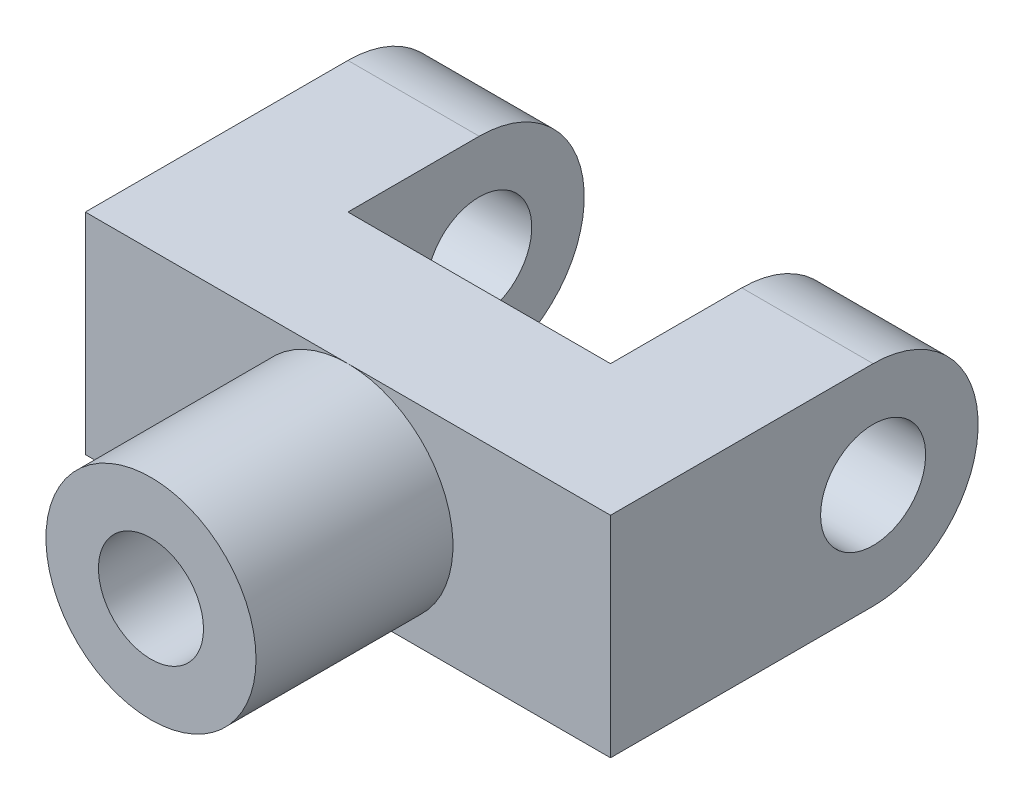
ISO-10303-21;
HEADER;
FILE_DESCRIPTION(('STEP AP214'),'2;1');
FILE_NAME('part.step','',(''),(''),'','','');
FILE_SCHEMA(('AUTOMOTIVE_DESIGN { 1 0 10303 214 1 1 1 1 }'));
ENDSEC;
DATA;
#1=APPLICATION_CONTEXT('core data for automotive mechanical design processes');
#2=APPLICATION_PROTOCOL_DEFINITION('international standard','automotive_design',2000,#1);
#3=PRODUCT_CONTEXT('',#1,'mechanical');
#4=PRODUCT('Part','Part','',(#3));
#5=PRODUCT_RELATED_PRODUCT_CATEGORY('part','',(#4));
#6=PRODUCT_DEFINITION_FORMATION('','',#4);
#7=PRODUCT_DEFINITION_CONTEXT('part definition',#1,'design');
#8=PRODUCT_DEFINITION('design','',#6,#7);
#9=PRODUCT_DEFINITION_SHAPE('','',#8);
#10=(LENGTH_UNIT() NAMED_UNIT(*) SI_UNIT(.MILLI.,.METRE.));
#11=(NAMED_UNIT(*) PLANE_ANGLE_UNIT() SI_UNIT($,.RADIAN.));
#12=(NAMED_UNIT(*) SI_UNIT($,.STERADIAN.) SOLID_ANGLE_UNIT());
#13=UNCERTAINTY_MEASURE_WITH_UNIT(LENGTH_MEASURE(1.E-05),#10,'distance_accuracy_value','');
#14=(GEOMETRIC_REPRESENTATION_CONTEXT(3) GLOBAL_UNCERTAINTY_ASSIGNED_CONTEXT((#13)) GLOBAL_UNIT_ASSIGNED_CONTEXT((#10,
#11,#12)) REPRESENTATION_CONTEXT('',''));
#15=CARTESIAN_POINT('',(0.,0.,0.));
#16=DIRECTION('',(0.,0.,1.));
#17=DIRECTION('',(1.,0.,0.));
#18=AXIS2_PLACEMENT_3D('',#15,#16,#17);
#19=CARTESIAN_POINT('',(0.,0.,-2.5));
#20=DIRECTION('',(0.,0.,1.));
#21=DIRECTION('',(1.,0.,0.));
#22=AXIS2_PLACEMENT_3D('',#19,#20,#21);
#23=PLANE('',#22);
#24=DIRECTION('',(0.,-1.,0.));
#25=VECTOR('',#24,1.);
#26=CARTESIAN_POINT('',(5.,0.,-2.5));
#27=LINE('',#26,#25);
#28=CARTESIAN_POINT('',(5.,4.,-2.5));
#29=VERTEX_POINT('',#28);
#30=CARTESIAN_POINT('',(5.,-4.,-2.5));
#31=VERTEX_POINT('',#30);
#32=EDGE_CURVE('E54',#29,#31,#27,.T.);
#33=ORIENTED_EDGE('',*,*,#32,.T.);
#34=DIRECTION('',(1.,0.,0.));
#35=VECTOR('',#34,1.);
#36=CARTESIAN_POINT('',(0.,-4.,-2.5));
#37=LINE('',#36,#35);
#38=CARTESIAN_POINT('',(-5.,-4.,-2.5));
#39=VERTEX_POINT('',#38);
#40=EDGE_CURVE('E184',#39,#31,#37,.T.);
#41=ORIENTED_EDGE('',*,*,#40,.F.);
#42=DIRECTION('',(0.,-1.,0.));
#43=VECTOR('',#42,1.);
#44=CARTESIAN_POINT('',(-5.,0.,-2.5));
#45=LINE('',#44,#43);
#46=CARTESIAN_POINT('',(-5.,4.,-2.5));
#47=VERTEX_POINT('',#46);
#48=EDGE_CURVE('E146',#47,#39,#45,.T.);
#49=ORIENTED_EDGE('',*,*,#48,.F.);
#50=DIRECTION('',(1.,0.,0.));
#51=VECTOR('',#50,1.);
#52=CARTESIAN_POINT('',(0.,4.,-2.5));
#53=LINE('',#52,#51);
#54=EDGE_CURVE('E49',#47,#29,#53,.T.);
#55=ORIENTED_EDGE('',*,*,#54,.T.);
#56=EDGE_LOOP('',(#33,#41,#49,#55));
#57=FACE_BOUND('',#56,.T.);
#58=ADVANCED_FACE('F34',(#57),#23,.F.);
#59=CARTESIAN_POINT('',(0.,0.,2.5));
#60=DIRECTION('',(0.,0.,1.));
#61=DIRECTION('',(1.,0.,0.));
#62=AXIS2_PLACEMENT_3D('',#59,#60,#61);
#63=PLANE('',#62);
#64=DIRECTION('',(1.,0.,0.));
#65=VECTOR('',#64,1.);
#66=CARTESIAN_POINT('',(0.,-4.,2.5));
#67=LINE('',#66,#65);
#68=CARTESIAN_POINT('',(-9.99999999999999,-4.,2.5));
#69=VERTEX_POINT('',#68);
#70=CARTESIAN_POINT('',(0.,-4.,2.5));
#71=VERTEX_POINT('',#70);
#72=EDGE_CURVE('E177',#69,#71,#67,.T.);
#73=ORIENTED_EDGE('',*,*,#72,.T.);
#74=CARTESIAN_POINT('',(0.,0.,2.5));
#75=DIRECTION('',(0.,0.,1.));
#76=DIRECTION('',(1.,0.,0.));
#77=AXIS2_PLACEMENT_3D('',#74,#75,#76);
#78=CIRCLE('',#77,4.);
#79=CARTESIAN_POINT('',(0.,4.,2.5));
#80=VERTEX_POINT('',#79);
#81=EDGE_CURVE('E42',#71,#80,#78,.F.);
#82=ORIENTED_EDGE('',*,*,#81,.T.);
#83=DIRECTION('',(1.,0.,0.));
#84=VECTOR('',#83,1.);
#85=CARTESIAN_POINT('',(0.,4.,2.5));
#86=LINE('',#85,#84);
#87=CARTESIAN_POINT('',(-10.,4.,2.5));
#88=VERTEX_POINT('',#87);
#89=EDGE_CURVE('E171',#88,#80,#86,.T.);
#90=ORIENTED_EDGE('',*,*,#89,.F.);
#91=DIRECTION('',(0.,-1.,0.));
#92=VECTOR('',#91,1.);
#93=CARTESIAN_POINT('',(-10.,0.,2.5));
#94=LINE('',#93,#92);
#95=EDGE_CURVE('E173',#88,#69,#94,.T.);
#96=ORIENTED_EDGE('',*,*,#95,.T.);
#97=EDGE_LOOP('',(#73,#82,#90,#96));
#98=FACE_BOUND('',#97,.T.);
#99=ADVANCED_FACE('F200',(#98),#63,.T.);
#100=CARTESIAN_POINT('',(0.,4.,2.5));
#101=DIRECTION('',(0.,1.,0.));
#102=DIRECTION('',(0.,0.,1.));
#103=AXIS2_PLACEMENT_3D('',#100,#101,#102);
#104=PLANE('',#103);
#105=ORIENTED_EDGE('',*,*,#89,.T.);
#106=CARTESIAN_POINT('',(10.,4.,2.5));
#107=VERTEX_POINT('',#106);
#108=EDGE_CURVE('E174',#80,#107,#86,.T.);
#109=ORIENTED_EDGE('',*,*,#108,.T.);
#110=DIRECTION('',(0.,0.,-1.));
#111=VECTOR('',#110,1.);
#112=CARTESIAN_POINT('',(10.,4.,2.5));
#113=LINE('',#112,#111);
#114=CARTESIAN_POINT('',(10.,4.,-7.5));
#115=VERTEX_POINT('',#114);
#116=EDGE_CURVE('E116',#107,#115,#113,.T.);
#117=ORIENTED_EDGE('',*,*,#116,.T.);
#118=DIRECTION('',(1.,0.,0.));
#119=VECTOR('',#118,1.);
#120=CARTESIAN_POINT('',(5.,4.,-7.5));
#121=LINE('',#120,#119);
#122=CARTESIAN_POINT('',(5.,4.,-7.5));
#123=VERTEX_POINT('',#122);
#124=EDGE_CURVE('E113',#123,#115,#121,.T.);
#125=ORIENTED_EDGE('',*,*,#124,.F.);
#126=DIRECTION('',(0.,0.,-1.));
#127=VECTOR('',#126,1.);
#128=CARTESIAN_POINT('',(5.,4.,0.));
#129=LINE('',#128,#127);
#130=EDGE_CURVE('E102',#29,#123,#129,.T.);
#131=ORIENTED_EDGE('',*,*,#130,.F.);
#132=ORIENTED_EDGE('',*,*,#54,.F.);
#133=DIRECTION('',(0.,0.,-1.));
#134=VECTOR('',#133,1.);
#135=CARTESIAN_POINT('',(-5.,4.,0.));
#136=LINE('',#135,#134);
#137=CARTESIAN_POINT('',(-5.,4.,-7.5));
#138=VERTEX_POINT('',#137);
#139=EDGE_CURVE('E149',#47,#138,#136,.T.);
#140=ORIENTED_EDGE('',*,*,#139,.T.);
#141=DIRECTION('',(-1.,0.,0.));
#142=VECTOR('',#141,1.);
#143=CARTESIAN_POINT('',(-5.,4.,-7.5));
#144=LINE('',#143,#142);
#145=CARTESIAN_POINT('',(-10.,4.,-7.5));
#146=VERTEX_POINT('',#145);
#147=EDGE_CURVE('E160',#138,#146,#144,.T.);
#148=ORIENTED_EDGE('',*,*,#147,.T.);
#149=DIRECTION('',(0.,0.,-1.));
#150=VECTOR('',#149,1.);
#151=CARTESIAN_POINT('',(-10.,4.,2.5));
#152=LINE('',#151,#150);
#153=EDGE_CURVE('E191',#88,#146,#152,.T.);
#154=ORIENTED_EDGE('',*,*,#153,.F.);
#155=EDGE_LOOP('',(#105,#109,#117,#125,#131,#132,#140,#148,#154));
#156=FACE_BOUND('',#155,.T.);
#157=ADVANCED_FACE('F36',(#156),#104,.T.);
#158=CARTESIAN_POINT('',(-10.,0.,2.5));
#159=DIRECTION('',(1.,0.,0.));
#160=DIRECTION('',(0.,1.,0.));
#161=AXIS2_PLACEMENT_3D('',#158,#159,#160);
#162=PLANE('',#161);
#163=ORIENTED_EDGE('',*,*,#153,.T.);
#164=CARTESIAN_POINT('',(-10.,0.,-7.5));
#165=DIRECTION('',(-1.,0.,0.));
#166=DIRECTION('',(0.,0.,1.));
#167=AXIS2_PLACEMENT_3D('',#164,#165,#166);
#168=CIRCLE('',#167,4.);
#169=CARTESIAN_POINT('',(-10.,-4.,-7.5));
#170=VERTEX_POINT('',#169);
#171=EDGE_CURVE('E138',#146,#170,#168,.T.);
#172=ORIENTED_EDGE('',*,*,#171,.T.);
#173=DIRECTION('',(0.,0.,-1.));
#174=VECTOR('',#173,1.);
#175=CARTESIAN_POINT('',(-9.99999999999999,-4.,2.5));
#176=LINE('',#175,#174);
#177=EDGE_CURVE('E189',#69,#170,#176,.T.);
#178=ORIENTED_EDGE('',*,*,#177,.F.);
#179=ORIENTED_EDGE('',*,*,#95,.F.);
#180=EDGE_LOOP('',(#163,#172,#178,#179));
#181=FACE_BOUND('',#180,.T.);
#182=CARTESIAN_POINT('',(-10.,0.,-7.5));
#183=DIRECTION('',(-1.,0.,0.));
#184=DIRECTION('',(0.,0.,1.));
#185=AXIS2_PLACEMENT_3D('',#182,#183,#184);
#186=CIRCLE('',#185,2.);
#187=CARTESIAN_POINT('',(-10.,0.,-5.5));
#188=VERTEX_POINT('',#187);
#189=EDGE_CURVE('E144',#188,#188,#186,.T.);
#190=ORIENTED_EDGE('',*,*,#189,.F.);
#191=EDGE_LOOP('',(#190));
#192=FACE_BOUND('',#191,.T.);
#193=ADVANCED_FACE('F209',(#181,#192),#162,.F.);
#194=CARTESIAN_POINT('',(0.,-4.,2.5));
#195=DIRECTION('',(0.,1.,0.));
#196=DIRECTION('',(0.,0.,1.));
#197=AXIS2_PLACEMENT_3D('',#194,#195,#196);
#198=PLANE('',#197);
#199=CARTESIAN_POINT('',(10.,-4.,2.5));
#200=VERTEX_POINT('',#199);
#201=EDGE_CURVE('E176',#71,#200,#67,.T.);
#202=ORIENTED_EDGE('',*,*,#201,.F.);
#203=ORIENTED_EDGE('',*,*,#72,.F.);
#204=ORIENTED_EDGE('',*,*,#177,.T.);
#205=DIRECTION('',(-1.,0.,0.));
#206=VECTOR('',#205,1.);
#207=CARTESIAN_POINT('',(-5.,-4.,-7.5));
#208=LINE('',#207,#206);
#209=CARTESIAN_POINT('',(-5.,-4.,-7.5));
#210=VERTEX_POINT('',#209);
#211=EDGE_CURVE('E155',#210,#170,#208,.T.);
#212=ORIENTED_EDGE('',*,*,#211,.F.);
#213=DIRECTION('',(0.,0.,-1.));
#214=VECTOR('',#213,1.);
#215=CARTESIAN_POINT('',(-5.,-4.,0.));
#216=LINE('',#215,#214);
#217=EDGE_CURVE('E143',#39,#210,#216,.T.);
#218=ORIENTED_EDGE('',*,*,#217,.F.);
#219=ORIENTED_EDGE('',*,*,#40,.T.);
#220=DIRECTION('',(0.,0.,-1.));
#221=VECTOR('',#220,1.);
#222=CARTESIAN_POINT('',(5.,-4.,0.));
#223=LINE('',#222,#221);
#224=CARTESIAN_POINT('',(5.,-4.,-7.5));
#225=VERTEX_POINT('',#224);
#226=EDGE_CURVE('E133',#31,#225,#223,.T.);
#227=ORIENTED_EDGE('',*,*,#226,.T.);
#228=DIRECTION('',(1.,0.,0.));
#229=VECTOR('',#228,1.);
#230=CARTESIAN_POINT('',(5.,-4.,-7.5));
#231=LINE('',#230,#229);
#232=CARTESIAN_POINT('',(10.,-4.,-7.5));
#233=VERTEX_POINT('',#232);
#234=EDGE_CURVE('E120',#225,#233,#231,.T.);
#235=ORIENTED_EDGE('',*,*,#234,.T.);
#236=DIRECTION('',(0.,0.,-1.));
#237=VECTOR('',#236,1.);
#238=CARTESIAN_POINT('',(10.,-4.,2.5));
#239=LINE('',#238,#237);
#240=EDGE_CURVE('E187',#200,#233,#239,.T.);
#241=ORIENTED_EDGE('',*,*,#240,.F.);
#242=EDGE_LOOP('',(#202,#203,#204,#212,#218,#219,#227,#235,#241));
#243=FACE_BOUND('',#242,.T.);
#244=ADVANCED_FACE('F213',(#243),#198,.F.);
#245=CARTESIAN_POINT('',(10.,0.,2.5));
#246=DIRECTION('',(1.,0.,0.));
#247=DIRECTION('',(0.,1.,0.));
#248=AXIS2_PLACEMENT_3D('',#245,#246,#247);
#249=PLANE('',#248);
#250=ORIENTED_EDGE('',*,*,#240,.T.);
#251=CARTESIAN_POINT('',(10.,0.,-7.5));
#252=DIRECTION('',(-1.,0.,0.));
#253=DIRECTION('',(0.,0.,1.));
#254=AXIS2_PLACEMENT_3D('',#251,#252,#253);
#255=CIRCLE('',#254,4.);
#256=EDGE_CURVE('E129',#115,#233,#255,.T.);
#257=ORIENTED_EDGE('',*,*,#256,.F.);
#258=ORIENTED_EDGE('',*,*,#116,.F.);
#259=DIRECTION('',(0.,-1.,0.));
#260=VECTOR('',#259,1.);
#261=CARTESIAN_POINT('',(10.,0.,2.5));
#262=LINE('',#261,#260);
#263=EDGE_CURVE('E180',#107,#200,#262,.T.);
#264=ORIENTED_EDGE('',*,*,#263,.T.);
#265=EDGE_LOOP('',(#250,#257,#258,#264));
#266=FACE_BOUND('',#265,.T.);
#267=CARTESIAN_POINT('',(10.,0.,-7.5));
#268=DIRECTION('',(-1.,0.,0.));
#269=DIRECTION('',(0.,0.,1.));
#270=AXIS2_PLACEMENT_3D('',#267,#268,#269);
#271=CIRCLE('',#270,2.);
#272=CARTESIAN_POINT('',(10.,0.,-5.5));
#273=VERTEX_POINT('',#272);
#274=EDGE_CURVE('E126',#273,#273,#271,.T.);
#275=ORIENTED_EDGE('',*,*,#274,.T.);
#276=EDGE_LOOP('',(#275));
#277=FACE_BOUND('',#276,.T.);
#278=ADVANCED_FACE('F216',(#266,#277),#249,.T.);
#279=ORIENTED_EDGE('',*,*,#108,.F.);
#280=EDGE_CURVE('E192',#80,#71,#78,.F.);
#281=ORIENTED_EDGE('',*,*,#280,.T.);
#282=ORIENTED_EDGE('',*,*,#201,.T.);
#283=ORIENTED_EDGE('',*,*,#263,.F.);
#284=EDGE_LOOP('',(#279,#281,#282,#283));
#285=FACE_BOUND('',#284,.T.);
#286=ADVANCED_FACE('F204',(#285),#63,.T.);
#287=CARTESIAN_POINT('',(0.,0.,10.));
#288=DIRECTION('',(0.,0.,-1.));
#289=DIRECTION('',(-1.,0.,0.));
#290=AXIS2_PLACEMENT_3D('',#287,#288,#289);
#291=CYLINDRICAL_SURFACE('',#290,2.);
#292=CARTESIAN_POINT('',(0.,0.,2.5));
#293=DIRECTION('',(0.,0.,1.));
#294=DIRECTION('',(1.,0.,0.));
#295=AXIS2_PLACEMENT_3D('',#292,#293,#294);
#296=CIRCLE('',#295,2.);
#297=CARTESIAN_POINT('',(2.,0.,2.5));
#298=VERTEX_POINT('',#297);
#299=EDGE_CURVE('E11',#298,#298,#296,.F.);
#300=ORIENTED_EDGE('',*,*,#299,.T.);
#301=EDGE_LOOP('',(#300));
#302=FACE_BOUND('',#301,.T.);
#303=CARTESIAN_POINT('',(0.,0.,10.));
#304=DIRECTION('',(0.,0.,1.));
#305=DIRECTION('',(1.,0.,0.));
#306=AXIS2_PLACEMENT_3D('',#303,#304,#305);
#307=CIRCLE('',#306,2.);
#308=CARTESIAN_POINT('',(2.,0.,10.));
#309=VERTEX_POINT('',#308);
#310=EDGE_CURVE('E163',#309,#309,#307,.T.);
#311=ORIENTED_EDGE('',*,*,#310,.T.);
#312=EDGE_LOOP('',(#311));
#313=FACE_BOUND('',#312,.T.);
#314=ADVANCED_FACE('F265',(#302,#313),#291,.F.);
#315=CARTESIAN_POINT('',(0.,0.,10.));
#316=DIRECTION('',(0.,0.,-1.));
#317=DIRECTION('',(-1.,0.,0.));
#318=AXIS2_PLACEMENT_3D('',#315,#316,#317);
#319=CYLINDRICAL_SURFACE('',#318,4.);
#320=ORIENTED_EDGE('',*,*,#81,.F.);
#321=ORIENTED_EDGE('',*,*,#280,.F.);
#322=EDGE_LOOP('',(#320,#321));
#323=FACE_BOUND('',#322,.T.);
#324=CARTESIAN_POINT('',(0.,0.,10.));
#325=DIRECTION('',(0.,0.,1.));
#326=DIRECTION('',(1.,0.,0.));
#327=AXIS2_PLACEMENT_3D('',#324,#325,#326);
#328=CIRCLE('',#327,4.);
#329=CARTESIAN_POINT('',(4.00000000000001,0.,10.));
#330=VERTEX_POINT('',#329);
#331=EDGE_CURVE('E168',#330,#330,#328,.T.);
#332=ORIENTED_EDGE('',*,*,#331,.F.);
#333=EDGE_LOOP('',(#332));
#334=FACE_BOUND('',#333,.T.);
#335=ADVANCED_FACE('F274',(#323,#334),#319,.T.);
#336=CARTESIAN_POINT('',(0.,0.,10.));
#337=DIRECTION('',(0.,0.,1.));
#338=DIRECTION('',(1.,0.,0.));
#339=AXIS2_PLACEMENT_3D('',#336,#337,#338);
#340=PLANE('',#339);
#341=ORIENTED_EDGE('',*,*,#310,.F.);
#342=EDGE_LOOP('',(#341));
#343=FACE_BOUND('',#342,.T.);
#344=ORIENTED_EDGE('',*,*,#331,.T.);
#345=EDGE_LOOP('',(#344));
#346=FACE_BOUND('',#345,.T.);
#347=ADVANCED_FACE('F284',(#343,#346),#340,.T.);
#348=ORIENTED_EDGE('',*,*,#299,.F.);
#349=EDGE_LOOP('',(#348));
#350=FACE_BOUND('',#349,.T.);
#351=ADVANCED_FACE('F239',(#350),#63,.T.);
#352=CARTESIAN_POINT('',(-5.,0.,-7.5));
#353=DIRECTION('',(-1.,0.,0.));
#354=DIRECTION('',(0.,0.,1.));
#355=AXIS2_PLACEMENT_3D('',#352,#353,#354);
#356=CYLINDRICAL_SURFACE('',#355,4.);
#357=ORIENTED_EDGE('',*,*,#171,.F.);
#358=ORIENTED_EDGE('',*,*,#147,.F.);
#359=CARTESIAN_POINT('',(-5.,0.,-7.5));
#360=DIRECTION('',(-1.,0.,0.));
#361=DIRECTION('',(0.,0.,1.));
#362=AXIS2_PLACEMENT_3D('',#359,#360,#361);
#363=CIRCLE('',#362,4.);
#364=EDGE_CURVE('E140',#138,#210,#363,.T.);
#365=ORIENTED_EDGE('',*,*,#364,.T.);
#366=ORIENTED_EDGE('',*,*,#211,.T.);
#367=EDGE_LOOP('',(#357,#358,#365,#366));
#368=FACE_BOUND('',#367,.T.);
#369=ADVANCED_FACE('F301',(#368),#356,.T.);
#370=CARTESIAN_POINT('',(-5.,0.,-7.5));
#371=DIRECTION('',(-1.,0.,0.));
#372=DIRECTION('',(0.,0.,1.));
#373=AXIS2_PLACEMENT_3D('',#370,#371,#372);
#374=CYLINDRICAL_SURFACE('',#373,2.);
#375=CARTESIAN_POINT('',(-5.,0.,-7.5));
#376=DIRECTION('',(-1.,0.,0.));
#377=DIRECTION('',(0.,0.,1.));
#378=AXIS2_PLACEMENT_3D('',#375,#376,#377);
#379=CIRCLE('',#378,2.);
#380=CARTESIAN_POINT('',(-5.,0.,-5.5));
#381=VERTEX_POINT('',#380);
#382=EDGE_CURVE('E152',#381,#381,#379,.T.);
#383=ORIENTED_EDGE('',*,*,#382,.F.);
#384=EDGE_LOOP('',(#383));
#385=FACE_BOUND('',#384,.T.);
#386=ORIENTED_EDGE('',*,*,#189,.T.);
#387=EDGE_LOOP('',(#386));
#388=FACE_BOUND('',#387,.T.);
#389=ADVANCED_FACE('F317',(#385,#388),#374,.F.);
#390=CARTESIAN_POINT('',(-5.,0.,0.));
#391=DIRECTION('',(-1.,0.,0.));
#392=DIRECTION('',(0.,0.,1.));
#393=AXIS2_PLACEMENT_3D('',#390,#391,#392);
#394=PLANE('',#393);
#395=ORIENTED_EDGE('',*,*,#364,.F.);
#396=ORIENTED_EDGE('',*,*,#139,.F.);
#397=ORIENTED_EDGE('',*,*,#48,.T.);
#398=ORIENTED_EDGE('',*,*,#217,.T.);
#399=EDGE_LOOP('',(#395,#396,#397,#398));
#400=FACE_BOUND('',#399,.T.);
#401=ORIENTED_EDGE('',*,*,#382,.T.);
#402=EDGE_LOOP('',(#401));
#403=FACE_BOUND('',#402,.T.);
#404=ADVANCED_FACE('F231',(#400,#403),#394,.F.);
#405=CARTESIAN_POINT('',(5.,0.,-7.5));
#406=DIRECTION('',(1.,0.,0.));
#407=DIRECTION('',(0.,0.,-1.));
#408=AXIS2_PLACEMENT_3D('',#405,#406,#407);
#409=CYLINDRICAL_SURFACE('',#408,4.);
#410=ORIENTED_EDGE('',*,*,#256,.T.);
#411=ORIENTED_EDGE('',*,*,#234,.F.);
#412=CARTESIAN_POINT('',(5.,0.,-7.5));
#413=DIRECTION('',(-1.,0.,0.));
#414=DIRECTION('',(0.,0.,1.));
#415=AXIS2_PLACEMENT_3D('',#412,#413,#414);
#416=CIRCLE('',#415,4.);
#417=EDGE_CURVE('E108',#123,#225,#416,.T.);
#418=ORIENTED_EDGE('',*,*,#417,.F.);
#419=ORIENTED_EDGE('',*,*,#124,.T.);
#420=EDGE_LOOP('',(#410,#411,#418,#419));
#421=FACE_BOUND('',#420,.T.);
#422=ADVANCED_FACE('F123',(#421),#409,.T.);
#423=CARTESIAN_POINT('',(5.,0.,-7.5));
#424=DIRECTION('',(1.,0.,0.));
#425=DIRECTION('',(0.,0.,-1.));
#426=AXIS2_PLACEMENT_3D('',#423,#424,#425);
#427=CYLINDRICAL_SURFACE('',#426,2.);
#428=CARTESIAN_POINT('',(5.,0.,-7.5));
#429=DIRECTION('',(-1.,0.,0.));
#430=DIRECTION('',(0.,0.,1.));
#431=AXIS2_PLACEMENT_3D('',#428,#429,#430);
#432=CIRCLE('',#431,2.);
#433=CARTESIAN_POINT('',(5.,0.,-5.5));
#434=VERTEX_POINT('',#433);
#435=EDGE_CURVE('E121',#434,#434,#432,.T.);
#436=ORIENTED_EDGE('',*,*,#435,.T.);
#437=EDGE_LOOP('',(#436));
#438=FACE_BOUND('',#437,.T.);
#439=ORIENTED_EDGE('',*,*,#274,.F.);
#440=EDGE_LOOP('',(#439));
#441=FACE_BOUND('',#440,.T.);
#442=ADVANCED_FACE('F222',(#438,#441),#427,.F.);
#443=CARTESIAN_POINT('',(5.,0.,0.));
#444=DIRECTION('',(1.,0.,0.));
#445=DIRECTION('',(0.,0.,1.));
#446=AXIS2_PLACEMENT_3D('',#443,#444,#445);
#447=PLANE('',#446);
#448=ORIENTED_EDGE('',*,*,#417,.T.);
#449=ORIENTED_EDGE('',*,*,#226,.F.);
#450=ORIENTED_EDGE('',*,*,#32,.F.);
#451=ORIENTED_EDGE('',*,*,#130,.T.);
#452=EDGE_LOOP('',(#448,#449,#450,#451));
#453=FACE_BOUND('',#452,.T.);
#454=ORIENTED_EDGE('',*,*,#435,.F.);
#455=EDGE_LOOP('',(#454));
#456=FACE_BOUND('',#455,.T.);
#457=ADVANCED_FACE('F104',(#453,#456),#447,.F.);
#458=CLOSED_SHELL('',(#58,#99,#157,#193,#244,#278,#286,#314,#335,#347,#351,#369,#389,#404,#422,
#442,#457));
#459=MANIFOLD_SOLID_BREP('B2',#458);
#460=ADVANCED_BREP_SHAPE_REPRESENTATION('',(#18,#459),#14);
#461=SHAPE_DEFINITION_REPRESENTATION(#9,#460);
ENDSEC;
END-ISO-10303-21;
